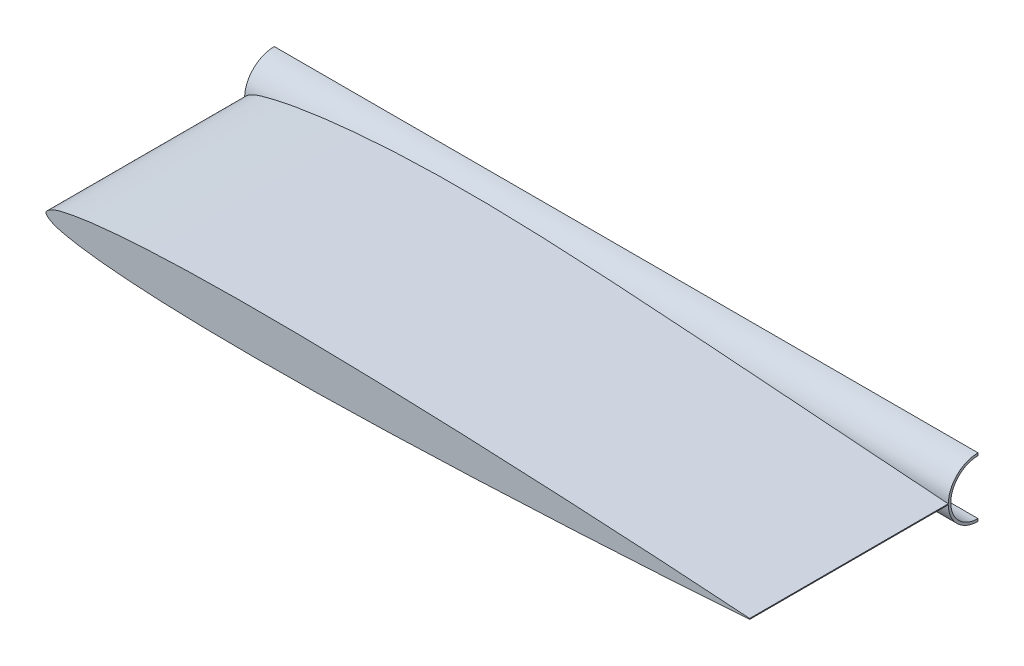
ISO-10303-21;
HEADER;
FILE_DESCRIPTION(('STEP AP214'),'2;1');
FILE_NAME('part.step','',(''),(''),'','','');
FILE_SCHEMA(('AUTOMOTIVE_DESIGN { 1 0 10303 214 1 1 1 1 }'));
ENDSEC;
DATA;
#1=APPLICATION_CONTEXT('core data for automotive mechanical design processes');
#2=APPLICATION_PROTOCOL_DEFINITION('international standard','automotive_design',2000,#1);
#3=PRODUCT_CONTEXT('',#1,'mechanical');
#4=PRODUCT('Part','Part','',(#3));
#5=PRODUCT_RELATED_PRODUCT_CATEGORY('part','',(#4));
#6=PRODUCT_DEFINITION_FORMATION('','',#4);
#7=PRODUCT_DEFINITION_CONTEXT('part definition',#1,'design');
#8=PRODUCT_DEFINITION('design','',#6,#7);
#9=PRODUCT_DEFINITION_SHAPE('','',#8);
#10=(LENGTH_UNIT() NAMED_UNIT(*) SI_UNIT(.MILLI.,.METRE.));
#11=(NAMED_UNIT(*) PLANE_ANGLE_UNIT() SI_UNIT($,.RADIAN.));
#12=(NAMED_UNIT(*) SI_UNIT($,.STERADIAN.) SOLID_ANGLE_UNIT());
#13=UNCERTAINTY_MEASURE_WITH_UNIT(LENGTH_MEASURE(1.E-05),#10,'distance_accuracy_value','');
#14=(GEOMETRIC_REPRESENTATION_CONTEXT(3) GLOBAL_UNCERTAINTY_ASSIGNED_CONTEXT((#13)) GLOBAL_UNIT_ASSIGNED_CONTEXT((#10,
#11,#12)) REPRESENTATION_CONTEXT('',''));
#15=CARTESIAN_POINT('',(0.,0.,0.));
#16=DIRECTION('',(0.,0.,1.));
#17=DIRECTION('',(1.,0.,0.));
#18=AXIS2_PLACEMENT_3D('',#15,#16,#17);
#19=CARTESIAN_POINT('',(0.,2.65648403185944E-13,0.));
#20=DIRECTION('',(0.,0.,-1.));
#21=DIRECTION('',(-1.,0.,0.));
#22=AXIS2_PLACEMENT_3D('',#19,#20,#21);
#23=PLANE('',#22);
#24=DIRECTION('',(-1.,0.,0.));
#25=VECTOR('',#24,1.);
#26=CARTESIAN_POINT('',(571.5,-22.098,0.));
#27=LINE('',#26,#25);
#28=CARTESIAN_POINT('',(571.5,-22.098,0.));
#29=VERTEX_POINT('',#28);
#30=CARTESIAN_POINT('',(0.,-22.098,0.));
#31=VERTEX_POINT('',#30);
#32=EDGE_CURVE('E49',#29,#31,#27,.T.);
#33=ORIENTED_EDGE('',*,*,#32,.F.);
#34=DIRECTION('',(0.,1.,0.));
#35=VECTOR('',#34,1.);
#36=CARTESIAN_POINT('',(571.5,0.360044999919579,0.));
#37=LINE('',#36,#35);
#38=CARTESIAN_POINT('',(571.5,-24.13,0.));
#39=VERTEX_POINT('',#38);
#40=EDGE_CURVE('E103',#39,#29,#37,.T.);
#41=ORIENTED_EDGE('',*,*,#40,.F.);
#42=DIRECTION('',(1.,0.,0.));
#43=VECTOR('',#42,1.);
#44=CARTESIAN_POINT('',(0.,-24.13,0.));
#45=LINE('',#44,#43);
#46=CARTESIAN_POINT('',(0.,-24.13,0.));
#47=VERTEX_POINT('',#46);
#48=EDGE_CURVE('E128',#47,#39,#45,.T.);
#49=ORIENTED_EDGE('',*,*,#48,.F.);
#50=DIRECTION('',(0.,1.,0.));
#51=VECTOR('',#50,1.);
#52=CARTESIAN_POINT('',(0.,-24.13,0.));
#53=LINE('',#52,#51);
#54=EDGE_CURVE('E163',#47,#31,#53,.T.);
#55=ORIENTED_EDGE('',*,*,#54,.T.);
#56=EDGE_LOOP('',(#33,#41,#49,#55));
#57=FACE_BOUND('',#56,.T.);
#58=ADVANCED_FACE('F33',(#57),#23,.T.);
#59=CARTESIAN_POINT('',(571.5,0.360044999919579,185.42));
#60=CARTESIAN_POINT('',(561.975510313426,1.01538717642884,185.42));
#61=CARTESIAN_POINT('',(542.928912588007,2.32590765775948,185.42));
#62=CARTESIAN_POINT('',(504.832156780951,4.7630267065629,185.42));
#63=CARTESIAN_POINT('',(457.210719030397,7.56222081538328,185.42));
#64=CARTESIAN_POINT('',(400.0595640761,10.5331616854128,185.42));
#65=CARTESIAN_POINT('',(342.909932380057,13.1215454403364,185.42));
#66=CARTESIAN_POINT('',(285.75975984895,15.2280111363781,185.42));
#67=CARTESIAN_POINT('',(228.608301613443,16.7302248223311,185.42));
#68=CARTESIAN_POINT('',(180.976079252393,17.2548876797488,185.42));
#69=CARTESIAN_POINT('',(142.872056014563,17.0472813553944,185.42));
#70=CARTESIAN_POINT('',(114.293689391611,16.4832136249963,185.42));
#71=CARTESIAN_POINT('',(85.7003991028661,15.3962416866348,185.42));
#72=CARTESIAN_POINT('',(61.9023768455399,13.8854038275558,185.42));
#73=CARTESIAN_POINT('',(42.8099405535945,12.0568553383374,185.42));
#74=CARTESIAN_POINT('',(28.6197496739266,10.3328197071644,185.42));
#75=CARTESIAN_POINT('',(16.2516084310247,7.95840471478376,185.42));
#76=CARTESIAN_POINT('',(7.18490939323513,5.85814304550578,185.42));
#77=CARTESIAN_POINT('',(-3.92729371811206,8.630435589854E-13,185.42));
#78=CARTESIAN_POINT('',(7.184909393234,-5.858143045507,185.42));
#79=CARTESIAN_POINT('',(16.2516084310231,-7.95840471478734,185.42));
#80=CARTESIAN_POINT('',(28.6197496739236,-10.3328197071719,185.42));
#81=CARTESIAN_POINT('',(42.8099405535911,-12.0568553383483,185.42));
#82=CARTESIAN_POINT('',(61.9023768455363,-13.885403827572,185.42));
#83=CARTESIAN_POINT('',(85.7003991028616,-15.396241686658,185.42));
#84=CARTESIAN_POINT('',(114.293689391606,-16.4832136250276,185.42));
#85=CARTESIAN_POINT('',(142.872056014559,-17.0472813554337,185.42));
#86=CARTESIAN_POINT('',(180.976079252388,-17.2548876797989,185.42));
#87=CARTESIAN_POINT('',(228.608301613438,-16.730224822395,185.42));
#88=CARTESIAN_POINT('',(285.759759848946,-15.228011136458,185.42));
#89=CARTESIAN_POINT('',(342.909932380053,-13.1215454404324,185.42));
#90=CARTESIAN_POINT('',(400.059564076098,-10.5331616855254,185.42));
#91=CARTESIAN_POINT('',(457.210719030393,-7.56222081551185,185.42));
#92=CARTESIAN_POINT('',(504.832156780949,-4.76302670670527,185.42));
#93=CARTESIAN_POINT('',(542.928912588006,-2.32590765791235,185.42));
#94=CARTESIAN_POINT('',(561.975510313426,-1.01538717658738,185.42));
#95=CARTESIAN_POINT('',(571.5,-0.360045000080395,185.42));
#96=B_SPLINE_CURVE_WITH_KNOTS('',3,(#59,#60,#61,#62,#63,#64,#65,#66,#67,#68,#69,#70,#71,#72,#73,
#74,#75,#76,#77,#78,#79,#80,#81,#82,#83,#84,#85,#86,#87,#88,#89,#90,#91,#92,#93,#94,#95),
.UNSPECIFIED.,.F.,.F.,(4,1,1,1,1,1,1,1,1,1,1,1,1,1,1,1,1,1,1,1,1,1,1,1,1,1,1,1,1,1,1,1,1,1,4),
(0.,0.0249245577594703,0.0498428830048284,0.0996630479535091,0.149464505803989,
0.199249098798805,0.249016479528594,0.298766909273868,0.348503608962617,0.373371187827416,
0.398243492902326,0.423129722742987,0.448051612806012,0.46054281715137,0.473079727808674,
0.485731111482558,0.492200581361296,0.5,0.507799418638703,0.514268888517442,0.526920272191325,
0.53945718284863,0.551948387193988,0.576870277257013,0.601756507097674,0.626628812172583,
0.651496391037383,0.701233090726132,0.750983520471406,0.800750901201195,0.850535494196011,
0.900336952046491,0.950157116995171,0.97507544224053,1.),.UNSPECIFIED.);
#97=DIRECTION('',(0.,0.,-1.));
#98=VECTOR('',#97,1.);
#99=SURFACE_OF_LINEAR_EXTRUSION('',#96,#98);
#100=DIRECTION('',(0.,0.,-1.));
#101=VECTOR('',#100,1.);
#102=CARTESIAN_POINT('',(571.5,0.360044999919579,185.42));
#103=LINE('',#102,#101);
#104=CARTESIAN_POINT('',(571.5,0.360044999919579,185.42));
#105=VERTEX_POINT('',#104);
#106=CARTESIAN_POINT('',(571.5,0.360044999919579,24.1273137252789));
#107=VERTEX_POINT('',#106);
#108=EDGE_CURVE('E117',#105,#107,#103,.T.);
#109=ORIENTED_EDGE('',*,*,#108,.T.);
#110=CARTESIAN_POINT('',(571.5,0.360044999919579,24.127313725279));
#111=CARTESIAN_POINT('',(569.494612814188,0.498027175384149,24.125259596626));
#112=CARTESIAN_POINT('',(567.489226862929,0.636010052244875,24.1220118367728));
#113=CARTESIAN_POINT('',(563.478430342691,0.911547541982615,24.113168949584));
#114=CARTESIAN_POINT('',(561.473019773708,1.04910215477898,24.1075738218065));
#115=CARTESIAN_POINT('',(557.462117903023,1.32335543382156,24.0940759942613));
#116=CARTESIAN_POINT('',(555.456626600565,1.46005408732549,24.0861732602244));
#117=CARTESIAN_POINT('',(551.445567431259,1.73217307716122,24.0681337717568));
#118=CARTESIAN_POINT('',(549.439999564419,1.86759341359446,24.0579970175036));
#119=CARTESIAN_POINT('',(545.427318678274,2.13679442832964,24.0355834067776));
#120=CARTESIAN_POINT('',(543.420205583739,2.27057385917179,24.0233050185052));
#121=CARTESIAN_POINT('',(539.405857530471,2.53608514698229,23.9967286049582));
#122=CARTESIAN_POINT('',(537.398622571738,2.66781700396972,23.9824305797025));
#123=CARTESIAN_POINT('',(531.376817973433,3.06019420514645,23.9366142678411));
#124=CARTESIAN_POINT('',(527.362086450996,3.31802534655848,23.9021733928371));
#125=CARTESIAN_POINT('',(521.338341127273,3.69992074183701,23.8450004869289));
#126=CARTESIAN_POINT('',(519.329456569418,3.82645355803826,23.825016389999));
#127=CARTESIAN_POINT('',(515.311611483961,4.07800766524361,23.7832506732919));
#128=CARTESIAN_POINT('',(513.302650956361,4.20302895628632,23.7614690535605));
#129=CARTESIAN_POINT('',(507.275662823469,4.57591051680113,23.6934967636217));
#130=CARTESIAN_POINT('',(503.257529414434,4.82158842639988,23.6446786697861));
#131=CARTESIAN_POINT('',(495.221001589961,5.30711378324128,23.5404566118722));
#132=CARTESIAN_POINT('',(491.202607174877,5.54696123824382,23.4850526565598));
#133=CARTESIAN_POINT('',(483.165567564045,6.02085496082444,23.368049998276));
#134=CARTESIAN_POINT('',(479.146922368327,6.25490122908315,23.3064512960314));
#135=CARTESIAN_POINT('',(467.090203884296,6.94839221046349,23.1129230412606));
#136=CARTESIAN_POINT('',(459.051769248333,7.39916363711595,22.9722668874875));
#137=CARTESIAN_POINT('',(442.973199069874,8.27778457864564,22.6704860382135));
#138=CARTESIAN_POINT('',(434.933063437439,8.70563171322267,22.5093592230134));
#139=CARTESIAN_POINT('',(422.879454013894,9.32990586101305,22.2544408129499));
#140=CARTESIAN_POINT('',(418.866279505055,9.53490511430028,22.1673473327695));
#141=CARTESIAN_POINT('',(410.839735797848,9.93922617734062,21.9890317130256));
#142=CARTESIAN_POINT('',(406.826366599476,10.1385479869726,21.897809573374));
#143=CARTESIAN_POINT('',(398.799550313024,10.5315564602255,21.711528671359));
#144=CARTESIAN_POINT('',(394.786103229992,10.7252432762173,21.6164700129016));
#145=CARTESIAN_POINT('',(386.759012355953,11.1067403590714,21.4229548269877));
#146=CARTESIAN_POINT('',(382.74536856495,11.2945506260416,21.3244982995935));
#147=CARTESIAN_POINT('',(370.705719985637,11.8486049728162,21.0248323268245));
#148=CARTESIAN_POINT('',(362.679391524291,12.2055514990304,20.8192888158671));
#149=CARTESIAN_POINT('',(350.64065887397,12.7204579314204,20.505786993676));
#150=CARTESIAN_POINT('',(346.628621009048,12.8886451326178,20.4004420412207));
#151=CARTESIAN_POINT('',(338.604281640505,13.2178956259174,20.1886713960415));
#152=CARTESIAN_POINT('',(334.591980136882,13.3789589179726,20.0822457033106));
#153=CARTESIAN_POINT('',(322.559036236083,13.850719909916,19.7625529128961));
#154=CARTESIAN_POINT('',(314.537961907818,14.1501773918521,19.5487541616788));
#155=CARTESIAN_POINT('',(302.506024746112,14.5745441726265,19.2320260334751));
#156=CARTESIAN_POINT('',(298.495648555551,14.7118531079274,19.1271199670072));
#157=CARTESIAN_POINT('',(290.474553177516,14.9778545903919,18.9195468618802));
#158=CARTESIAN_POINT('',(286.463833990006,15.1065471366607,18.8168798234535));
#159=CARTESIAN_POINT('',(274.429491880497,15.4789920422542,18.5137723368665));
#160=CARTESIAN_POINT('',(266.405307058189,15.7090540576267,18.3182690569277));
#161=CARTESIAN_POINT('',(254.365427372041,16.0217052728962,18.0438718543567));
#162=CARTESIAN_POINT('',(250.350366496448,16.120539377309,17.9555261442389));
#163=CARTESIAN_POINT('',(242.319803333118,16.3065222035136,17.786791593053));
#164=CARTESIAN_POINT('',(238.304301045302,16.3936709231806,17.7064027534319));
#165=CARTESIAN_POINT('',(230.268903256341,16.5555546787813,17.5551362412387));
#166=CARTESIAN_POINT('',(226.249007326981,16.6302773913937,17.4842680238351));
#167=CARTESIAN_POINT('',(218.208798002674,16.7661720094394,17.3539978259112));
#168=CARTESIAN_POINT('',(214.188484607807,16.8273439174757,17.2945958431884));
#169=CARTESIAN_POINT('',(206.141704769667,16.9349787817641,17.1892143582592));
#170=CARTESIAN_POINT('',(202.1152377834,16.9814204828883,17.1432542595567));
#171=CARTESIAN_POINT('',(194.061997565483,17.0582804440231,17.0667787834912));
#172=CARTESIAN_POINT('',(190.035224333785,17.088698701515,17.036263408556));
#173=CARTESIAN_POINT('',(183.291659925335,17.1252030604681,16.9995508527358));
#174=CARTESIAN_POINT('',(180.574918641098,17.1359858044427,16.9886718524777));
#175=CARTESIAN_POINT('',(175.14139314999,17.1493504901306,16.975181214688));
#176=CARTESIAN_POINT('',(172.424608943106,17.1519324294573,16.9725695795622));
#177=CARTESIAN_POINT('',(166.99104897754,17.1484610984726,16.9760769888822));
#178=CARTESIAN_POINT('',(164.274273218863,17.1424078231369,16.9821960384076));
#179=CARTESIAN_POINT('',(158.839834737006,17.1208998590137,17.0038797380296));
#180=CARTESIAN_POINT('',(156.122172039667,17.1054418485908,17.0194477253686));
#181=CARTESIAN_POINT('',(150.686998623769,17.0643949733378,17.0606029137189));
#182=CARTESIAN_POINT('',(147.969487905153,17.0388061124063,17.0861901108744));
#183=CARTESIAN_POINT('',(142.534708266083,16.976778819242,17.1478219496162));
#184=CARTESIAN_POINT('',(139.817439345546,16.9403403908163,17.183866587533));
#185=CARTESIAN_POINT('',(134.385507447698,16.855813874669,17.2667873519538));
#186=CARTESIAN_POINT('',(131.670844182772,16.8077355020643,17.3136544441481));
#187=CARTESIAN_POINT('',(126.24197994774,16.6990251475909,17.4185293450513));
#188=CARTESIAN_POINT('',(123.527778978107,16.6383931529663,17.4765371650803));
#189=CARTESIAN_POINT('',(118.099964468624,16.5037384765016,17.6037523299485));
#190=CARTESIAN_POINT('',(115.386350930033,16.4297157662772,17.6729596985273));
#191=CARTESIAN_POINT('',(109.964927891871,16.2674549113691,17.8224291516329));
#192=CARTESIAN_POINT('',(107.257117017368,16.1792435729358,17.9026703495135));
#193=CARTESIAN_POINT('',(101.842422495067,15.986907839188,18.0746322638326));
#194=CARTESIAN_POINT('',(99.1355388458325,15.8827834686446,18.1663529624015));
#195=CARTESIAN_POINT('',(95.0760734848016,15.713520118641,18.3125014667624));
#196=CARTESIAN_POINT('',(93.7230614025541,15.6549195211512,18.3626455569375));
#197=CARTESIAN_POINT('',(91.0173489750398,15.5331589423579,18.465758722287));
#198=CARTESIAN_POINT('',(89.6646486298327,15.4699989601824,18.5187277980017));
#199=CARTESIAN_POINT('',(86.9632206476611,15.339123718419,18.6272754840022));
#200=CARTESIAN_POINT('',(85.6144920989976,15.2714211496957,18.6828467030957));
#201=CARTESIAN_POINT('',(82.917410425172,15.1310235113904,18.7967338525828));
#202=CARTESIAN_POINT('',(81.5690572999852,15.0583284421354,18.8550497827965));
#203=CARTESIAN_POINT('',(78.872779922257,14.9074461633021,18.9745676127859));
#204=CARTESIAN_POINT('',(77.5248556712992,14.8292589336762,19.0357695230958));
#205=CARTESIAN_POINT('',(74.8295045925849,14.6669347642415,19.161117226153));
#206=CARTESIAN_POINT('',(73.4820777647104,14.5827978258443,19.225263018202));
#207=CARTESIAN_POINT('',(69.4405594511022,14.3207574251521,19.4221721561944));
#208=CARTESIAN_POINT('',(66.7472941931586,14.1332279175164,19.559404428625));
#209=CARTESIAN_POINT('',(62.7133700254269,13.8302382513466,19.7736325095592));
#210=CARTESIAN_POINT('',(61.3716459979142,13.7257912085777,19.8463281493906));
#211=CARTESIAN_POINT('',(58.6889711095807,13.509161048891,19.9944170185063));
#212=CARTESIAN_POINT('',(57.3480202474593,13.3969779450253,20.0698102432393));
#213=CARTESIAN_POINT('',(54.6669896774844,13.1644591635801,20.2230881226757));
#214=CARTESIAN_POINT('',(53.3269099561783,13.0441236150649,20.3009727379268));
#215=CARTESIAN_POINT('',(50.6476654850381,12.7949240436153,20.4589489510625));
#216=CARTESIAN_POINT('',(49.3085007394561,12.6660599813148,20.5390405591332));
#217=CARTESIAN_POINT('',(47.3005527834371,12.4660507700136,20.6606039936148));
#218=CARTESIAN_POINT('',(46.6313902390493,12.3982643338253,20.7013615532925));
#219=CARTESIAN_POINT('',(45.2933269391648,12.2603955297628,20.7833114445876));
#220=CARTESIAN_POINT('',(44.6244261840186,12.1903131588247,20.824503776785));
#221=CARTESIAN_POINT('',(43.6212848691747,12.0834210765782,20.886587377707));
#222=CARTESIAN_POINT('',(43.2869407081742,12.0474957721984,20.9073310133866));
#223=CARTESIAN_POINT('',(42.6183224493576,11.975050875091,20.9489092929345));
#224=CARTESIAN_POINT('',(42.2840483515509,11.9385312822844,20.969743936815));
#225=CARTESIAN_POINT('',(41.281349463954,11.8279709061403,21.0324319392949));
#226=CARTESIAN_POINT('',(40.6130458507015,11.752928288295,21.0744695064017));
#227=CARTESIAN_POINT('',(39.6919774694922,11.6472034902939,21.1329280570582));
#228=CARTESIAN_POINT('',(39.4390307804495,11.6179297712962,21.1490363914483));
#229=CARTESIAN_POINT('',(38.9332037423362,11.5588784195628,21.1813683087685));
#230=CARTESIAN_POINT('',(38.680323393224,11.529100787144,21.1975918916262));
#231=CARTESIAN_POINT('',(37.9217920374367,11.4389634941452,21.2464511913556));
#232=CARTESIAN_POINT('',(37.4162484838272,11.3777991814642,21.2792756012634));
#233=CARTESIAN_POINT('',(36.405244982453,11.2530402402847,21.3455142172156));
#234=CARTESIAN_POINT('',(35.8997851991166,11.1894444271282,21.3789287063756));
#235=CARTESIAN_POINT('',(34.8892469475304,11.0596079243544,21.4463823778531));
#236=CARTESIAN_POINT('',(34.3841684800257,10.9933672295836,21.4804215613878));
#237=CARTESIAN_POINT('',(32.8682328192484,10.7901374292805,21.5836281313882));
#238=CARTESIAN_POINT('',(31.8580181024714,10.6488049819081,21.6537968113347));
#239=CARTESIAN_POINT('',(30.3431742394655,10.4266926062339,21.7611519836912));
#240=CARTESIAN_POINT('',(29.8377411975389,10.3508790943105,21.7973290250235));
#241=CARTESIAN_POINT('',(28.8274689616563,10.1956918081548,21.8703480845957));
#242=CARTESIAN_POINT('',(28.3226297675778,10.1163180346581,21.9071901026982));
#243=CARTESIAN_POINT('',(27.3119562221961,9.95376833178107,21.9815240876133));
#244=CARTESIAN_POINT('',(26.8061238138175,9.87058111065058,22.0190177491496));
#245=CARTESIAN_POINT('',(25.7950426390187,9.70086682294544,22.0943138614026));
#246=CARTESIAN_POINT('',(25.2897938730566,9.61433975375101,22.1321163123614));
#247=CARTESIAN_POINT('',(24.2778026232203,9.43772551225243,22.2080055779193));
#248=CARTESIAN_POINT('',(23.77106246581,9.34762524396369,22.2460929233527));
#249=CARTESIAN_POINT('',(22.7581405838983,9.16432303417074,22.3222295820734));
#250=CARTESIAN_POINT('',(22.2519588596202,9.07112109142595,22.3602788953455));
#251=CARTESIAN_POINT('',(21.2500419544565,8.88356055550116,22.435446469351));
#252=CARTESIAN_POINT('',(20.7542961299645,8.7892602597023,22.4725683823267));
#253=CARTESIAN_POINT('',(19.7633281334266,8.59783016849089,22.5465018706431));
#254=CARTESIAN_POINT('',(19.268105961105,8.50070037456827,22.5833134461473));
#255=CARTESIAN_POINT('',(18.277639994742,8.30353847782299,22.6565490270252));
#256=CARTESIAN_POINT('',(17.7823967805176,8.20350328897694,22.6929725596099));
#257=CARTESIAN_POINT('',(16.7924434598551,8.00065334451399,22.7652820020963));
#258=CARTESIAN_POINT('',(16.2977333489529,7.89783861236379,22.801167916533));
#259=CARTESIAN_POINT('',(15.3098193281881,7.68958836686872,22.8722348529092));
#260=CARTESIAN_POINT('',(14.8166143521236,7.58415827970912,22.9074170988225));
#261=CARTESIAN_POINT('',(13.8306900169926,7.37052753271516,22.9770570978251));
#262=CARTESIAN_POINT('',(13.337970701885,7.26232664241344,23.0115147902112));
#263=CARTESIAN_POINT('',(12.6020980308332,7.09243709078364,23.0642067366271));
#264=CARTESIAN_POINT('',(12.3580000477238,7.03470948485238,23.0818889216308));
#265=CARTESIAN_POINT('',(11.8706872432773,6.91579001707586,23.1177989955674));
#266=CARTESIAN_POINT('',(11.627472418384,6.85459816919675,23.1360268823));
#267=CARTESIAN_POINT('',(11.1422265936999,6.72806711792622,23.1731385571863));
#268=CARTESIAN_POINT('',(10.9001953495139,6.6627288133595,23.1920222027923));
#269=CARTESIAN_POINT('',(10.4174924845036,6.52738828771356,23.2304767697962));
#270=CARTESIAN_POINT('',(10.1768208627964,6.4573860696637,23.2500476907475));
#271=CARTESIAN_POINT('',(9.69826582700028,6.31278686781427,23.289723294121));
#272=CARTESIAN_POINT('',(9.46037443623893,6.23821541430176,23.309824707134));
#273=CARTESIAN_POINT('',(8.98627383402238,6.08403587108533,23.3505409500717));
#274=CARTESIAN_POINT('',(8.75006461874624,6.00442779282575,23.3711557788297));
#275=CARTESIAN_POINT('',(8.27934610792604,5.84017673204443,23.41274042114));
#276=CARTESIAN_POINT('',(8.04483740633197,5.75553207721134,23.4337103509256));
#277=CARTESIAN_POINT('',(7.57764931817624,5.58137257146053,23.4758003370669));
#278=CARTESIAN_POINT('',(7.34496994104682,5.49185769545009,23.4969203941956));
#279=CARTESIAN_POINT('',(6.88171300746138,5.30828326347574,23.5390717315741));
#280=CARTESIAN_POINT('',(6.65113335237297,5.21422901973892,23.5601030857095));
#281=CARTESIAN_POINT('',(6.19197288147391,5.02130057648938,23.6019741998046));
#282=CARTESIAN_POINT('',(5.96339210738784,4.92242627664488,23.6228139557653));
#283=CARTESIAN_POINT('',(5.50858883811098,4.71954033996288,23.6641829859274));
#284=CARTESIAN_POINT('',(5.28236553386649,4.61553054093332,23.6847123678139));
#285=CARTESIAN_POINT('',(4.83259736453702,4.40181643870498,23.7253609652572));
#286=CARTESIAN_POINT('',(4.60905228020916,4.29211260560279,23.745480214484));
#287=CARTESIAN_POINT('',(4.29343202059809,4.13150270056285,23.773723379622));
#288=CARTESIAN_POINT('',(4.20002289399743,4.08324725441024,23.7820614902435));
#289=CARTESIAN_POINT('',(4.0138402026654,3.98551083924533,23.7986356760032));
#290=CARTESIAN_POINT('',(3.9210666313082,3.93602988303418,23.8068717522058));
#291=CARTESIAN_POINT('',(3.64361043594071,3.78553259516665,23.8314287634577));
#292=CARTESIAN_POINT('',(3.45997079295462,3.68255224225761,23.8475824963004));
#293=CARTESIAN_POINT('',(3.09594959437441,3.47044399005547,23.8793726226509));
#294=CARTESIAN_POINT('',(2.91557176719675,3.36130957884926,23.8950084392728));
#295=CARTESIAN_POINT('',(2.5600493789457,3.13641142314574,23.9255647692203));
#296=CARTESIAN_POINT('',(2.38488503737741,3.0206794753751,23.9404881662476));
#297=CARTESIAN_POINT('',(2.04050032381067,2.78077944686619,23.9695387000511));
#298=CARTESIAN_POINT('',(1.87127519090307,2.65661836864271,23.9836664803587));
#299=CARTESIAN_POINT('',(1.62366475645012,2.46256874915916,24.0041008293722));
#300=CARTESIAN_POINT('',(1.54221312041559,2.39662637025988,24.0107822532103));
#301=CARTESIAN_POINT('',(1.38177873297129,2.26178447574357,24.0238595003009));
#302=CARTESIAN_POINT('',(1.30279565212165,2.1928853576543,24.0302553617122));
#303=CARTESIAN_POINT('',(1.14647187920411,2.05050059622146,24.0428273063287));
#304=CARTESIAN_POINT('',(1.06918453412095,1.97695558437496,24.0489975427559));
#305=CARTESIAN_POINT('',(0.918481665492981,1.82590484653268,24.0609375283347));
#306=CARTESIAN_POINT('',(0.845067227923733,1.74839802150157,24.0667071652987));
#307=CARTESIAN_POINT('',(0.703331022064382,1.58903799237772,24.0777537919977));
#308=CARTESIAN_POINT('',(0.635000371972552,1.50719281774495,24.0830316451971));
#309=CARTESIAN_POINT('',(0.504823306882013,1.33850595503505,24.0929955726817));
#310=CARTESIAN_POINT('',(0.442972605999538,1.25166762909542,24.0976820385395));
#311=CARTESIAN_POINT('',(0.320718083514809,1.06143395909311,24.1068538675474));
#312=CARTESIAN_POINT('',(0.261414364112847,0.957312002068602,24.1112446991522));
#313=CARTESIAN_POINT('',(0.157661841123485,0.741815303061232,24.1188347792517));
#314=CARTESIAN_POINT('',(0.113193882276302,0.630450137054671,24.1220355648957));
#315=CARTESIAN_POINT('',(0.0503357395095094,0.421327727214955,24.1265061366657));
#316=CARTESIAN_POINT('',(0.0287562432203592,0.324569877170833,24.1280148626448));
#317=CARTESIAN_POINT('',(0.00884489231593004,0.177842317380321,24.1293944319177));
#318=CARTESIAN_POINT('',(0.00428339744100345,0.128688903654821,24.1297070887817));
#319=CARTESIAN_POINT('',(-0.000449023330365366,0.0301717032563756,24.1300314445687));
#320=CARTESIAN_POINT('',(-0.000620279212654756,-0.0191920673264529,24.1300431661109));
#321=CARTESIAN_POINT('',(0.00551570170625618,-0.166987472515772,24.129622346605));
#322=CARTESIAN_POINT('',(0.0184626801205455,-0.265195951664034,24.1287345075856));
#323=CARTESIAN_POINT('',(0.0597119442308195,-0.458347396781908,24.1258412887696));
#324=CARTESIAN_POINT('',(0.0880472555298011,-0.553282870683401,24.1238335051566));
#325=CARTESIAN_POINT('',(0.149290317615117,-0.717792148090826,24.1194291289234));
#326=CARTESIAN_POINT('',(0.179771891779413,-0.788303086172681,24.1172188944386));
#327=CARTESIAN_POINT('',(0.246825875574952,-0.92637753980592,24.1123101344979));
#328=CARTESIAN_POINT('',(0.28340197521158,-0.993939238238387,24.1096113131351));
#329=CARTESIAN_POINT('',(0.361570178250588,-1.12623700827276,24.1037940085351));
#330=CARTESIAN_POINT('',(0.403172608544024,-1.19096687714597,24.1006746597237));
#331=CARTESIAN_POINT('',(0.490400942395612,-1.31759986979217,24.0940832800822));
#332=CARTESIAN_POINT('',(0.536026169968919,-1.37950346584435,24.0906113084914));
#333=CARTESIAN_POINT('',(0.642490709930981,-1.51598110760428,24.0824517513156));
#334=CARTESIAN_POINT('',(0.704266606252319,-1.58981702593247,24.0776783137827));
#335=CARTESIAN_POINT('',(0.831912015664952,-1.73385521926975,24.0677347886702));
#336=CARTESIAN_POINT('',(0.897783203625949,-1.8040559857943,24.062564538599));
#337=CARTESIAN_POINT('',(1.03288631018629,-1.94129458989901,24.0518818270754));
#338=CARTESIAN_POINT('',(1.10212272926807,-2.00832794149002,24.046368904443));
#339=CARTESIAN_POINT('',(1.24327692979918,-2.13949293430815,24.0350535160742));
#340=CARTESIAN_POINT('',(1.315195180578,-2.20362406324843,24.0292509995971));
#341=CARTESIAN_POINT('',(1.53496231142377,-2.39275210476871,24.011409183266));
#342=CARTESIAN_POINT('',(1.68616101608962,-2.51382676436461,23.9989880051525));
#343=CARTESIAN_POINT('',(1.99467826120484,-2.74741706176597,23.9733677163172));
#344=CARTESIAN_POINT('',(2.15199162465143,-2.85993971146366,23.9601692590066));
#345=CARTESIAN_POINT('',(2.49360203678217,-3.09325299553203,23.9312426433819));
#346=CARTESIAN_POINT('',(2.67859899649785,-3.21300325508332,23.9154186386444));
#347=CARTESIAN_POINT('',(3.05316826873306,-3.44505828549408,23.8830940632667));
#348=CARTESIAN_POINT('',(3.24274156302351,-3.55736143899532,23.8665933469096));
#349=CARTESIAN_POINT('',(3.62577375177264,-3.77583500176149,23.833006546388));
#350=CARTESIAN_POINT('',(3.81923894512966,-3.88199417314083,23.815919475309));
#351=CARTESIAN_POINT('',(4.20905070280257,-4.0888259144109,23.7812824081109));
#352=CARTESIAN_POINT('',(4.40539751452015,-4.18949800966886,23.7637323721395));
#353=CARTESIAN_POINT('',(4.80062564288295,-4.38606415386455,23.728238881752));
#354=CARTESIAN_POINT('',(4.99950887151258,-4.48195429358496,23.7102951221806));
#355=CARTESIAN_POINT('',(5.39930358385222,-4.66935093669365,23.6741032868466));
#356=CARTESIAN_POINT('',(5.60021511029761,-4.76085734748429,23.6558552046669));
#357=CARTESIAN_POINT('',(6.00421124291469,-4.94001779595407,23.619091875952));
#358=CARTESIAN_POINT('',(6.20729942076664,-5.02766367269139,23.6005761639404));
#359=CARTESIAN_POINT('',(6.61506171709901,-5.19914548347198,23.5633928641579));
#360=CARTESIAN_POINT('',(6.81973583137415,-5.28298142761365,23.5447252767899));
#361=CARTESIAN_POINT('',(7.23025320382326,-5.44687934780819,23.5073489364855));
#362=CARTESIAN_POINT('',(7.43609443949123,-5.52694641165921,23.4886402769412));
#363=CARTESIAN_POINT('',(7.84921351802451,-5.68330195631427,23.451299343049));
#364=CARTESIAN_POINT('',(8.0564913521431,-5.75959046010102,23.4326670682373));
#365=CARTESIAN_POINT('',(8.47233393457042,-5.90821934349366,23.3956343571641));
#366=CARTESIAN_POINT('',(8.68089781255333,-5.98056212353133,23.3772337853047));
#367=CARTESIAN_POINT('',(9.09938575753549,-6.12129732893319,23.3407777069753));
#368=CARTESIAN_POINT('',(9.30930983370706,-6.1896897276276,23.3227222028354));
#369=CARTESIAN_POINT('',(9.72770214123609,-6.32168736683858,23.2872879234159));
#370=CARTESIAN_POINT('',(9.93615393583466,-6.38534319588075,23.2699034079915));
#371=CARTESIAN_POINT('',(10.3541958313622,-6.50895256570034,23.2356310670891));
#372=CARTESIAN_POINT('',(10.5637859523385,-6.56890604104297,23.2187432503923));
#373=CARTESIAN_POINT('',(10.9839824391927,-6.68534270842156,23.1854859759127));
#374=CARTESIAN_POINT('',(11.1945888729868,-6.74182566497335,23.1691165533407));
#375=CARTESIAN_POINT('',(11.6166546508075,-6.85166173355239,23.1368733437383));
#376=CARTESIAN_POINT('',(11.8281140053158,-6.90501480699007,23.12099956282));
#377=CARTESIAN_POINT('',(12.2519669935998,-7.00910557446917,23.0896578012086));
#378=CARTESIAN_POINT('',(12.4643614314907,-7.05984013251734,23.0741903175105));
#379=CARTESIAN_POINT('',(12.8896694154073,-7.15917661286371,23.0435629104447));
#380=CARTESIAN_POINT('',(13.1025829638319,-7.20777852528732,23.0284029885011));
#381=CARTESIAN_POINT('',(13.5287588105478,-7.30346634862157,22.9982346489523));
#382=CARTESIAN_POINT('',(13.7420211076878,-7.35055226452721,22.9832262308479));
#383=CARTESIAN_POINT('',(14.0620544837929,-7.42052915121467,22.9606891314672));
#384=CARTESIAN_POINT('',(14.1687555353487,-7.44374610224423,22.9531726906896));
#385=CARTESIAN_POINT('',(14.3821845230493,-7.49004526692085,22.9381061686339));
#386=CARTESIAN_POINT('',(14.4889124591954,-7.51312748056094,22.9305560873541));
#387=CARTESIAN_POINT('',(14.8095822393031,-7.5822720142622,22.9078241847658));
#388=CARTESIAN_POINT('',(15.023563579379,-7.62813480001637,22.8925920911432));
#389=CARTESIAN_POINT('',(15.4516295455178,-7.71933158747927,22.8620019457914));
#390=CARTESIAN_POINT('',(15.6657141714468,-7.76466558987101,22.846643894225));
#391=CARTESIAN_POINT('',(16.3081118225026,-7.89987778188944,22.8003927042217));
#392=CARTESIAN_POINT('',(16.7365781418117,-7.98896820898853,22.7693218548872));
#393=CARTESIAN_POINT('',(17.5944814800295,-8.16517625639423,22.7067291676605));
#394=CARTESIAN_POINT('',(18.02391903155,-8.25229108872971,22.675206783824));
#395=CARTESIAN_POINT('',(18.8831927945605,-8.42441931099137,22.6118214940818));
#396=CARTESIAN_POINT('',(19.3130290088331,-8.50943268613321,22.5799585857827));
#397=CARTESIAN_POINT('',(20.6035555682916,-8.7613769286716,22.483938476274));
#398=CARTESIAN_POINT('',(21.4648397703498,-8.92512478488325,22.4193809735341));
#399=CARTESIAN_POINT('',(23.1887386221999,-9.24376212983332,22.2898926538774));
#400=CARTESIAN_POINT('',(24.0513527705791,-9.39865437802413,22.224961960266));
#401=CARTESIAN_POINT('',(25.3478865296373,-9.62419834654926,22.127775356542));
#402=CARTESIAN_POINT('',(25.7811859965772,-9.69835894869398,22.0953637262648));
#403=CARTESIAN_POINT('',(26.6482147438972,-9.84422512108709,22.030762410929));
#404=CARTESIAN_POINT('',(27.0819440239259,-9.91593069334142,21.998572725689));
#405=CARTESIAN_POINT('',(27.9492714012754,-10.0566708565614,21.934590002935));
#406=CARTESIAN_POINT('',(28.3828689090366,-10.1257088653414,21.9027964957922));
#407=CARTESIAN_POINT('',(29.2505150844071,-10.2611171069311,21.8396877360879));
#408=CARTESIAN_POINT('',(29.6845637520799,-10.3274873393663,21.8083724835936));
#409=CARTESIAN_POINT('',(30.5526623146383,-10.4576379291969,21.7462617999892));
#410=CARTESIAN_POINT('',(30.9867118164854,-10.5214206875033,21.7154659032307));
#411=CARTESIAN_POINT('',(31.8551915477939,-10.6465860857602,21.6543748763603));
#412=CARTESIAN_POINT('',(32.2896217773825,-10.7079687249083,21.6240797464158));
#413=CARTESIAN_POINT('',(33.5929289948509,-10.8886501108367,21.5339809665124));
#414=CARTESIAN_POINT('',(34.4623294122189,-11.0045580008602,21.4749276573108));
#415=CARTESIAN_POINT('',(36.2020461388819,-11.2284643857782,21.3587076723742));
#416=CARTESIAN_POINT('',(37.0723621638954,-11.3364648564194,21.3015405273371));
#417=CARTESIAN_POINT('',(38.3785210273302,-11.4935107912195,21.2169656877554));
#418=CARTESIAN_POINT('',(38.814029953496,-11.5450345975408,21.1889695196636));
#419=CARTESIAN_POINT('',(39.6852434399838,-11.646593640649,21.1333175128397));
#420=CARTESIAN_POINT('',(40.1209480004419,-11.6966288763988,21.1056616743446));
#421=CARTESIAN_POINT('',(41.4152783117317,-11.8432885481841,21.0239350631566));
#422=CARTESIAN_POINT('',(42.2741436322183,-11.9380216264616,20.9702657342452));
#423=CARTESIAN_POINT('',(43.9923311616695,-12.123604488723,20.8635214322643));
#424=CARTESIAN_POINT('',(44.851653371831,-12.2144542624823,20.8104464607601));
#425=CARTESIAN_POINT('',(46.5712697790445,-12.3923935205316,20.7049800961983));
#426=CARTESIAN_POINT('',(47.4315642484046,-12.4794806385141,20.6525891473623));
#427=CARTESIAN_POINT('',(49.1525644177745,-12.6499725457757,20.548602372527));
#428=CARTESIAN_POINT('',(50.0132701171806,-12.7333773404432,20.4970065453642));
#429=CARTESIAN_POINT('',(51.7354332787598,-12.8966479397221,20.3946723654113));
#430=CARTESIAN_POINT('',(52.5968909048158,-12.9765122467899,20.3439343809773));
#431=CARTESIAN_POINT('',(54.3201760311865,-13.1327741812222,20.2434129358901));
#432=CARTESIAN_POINT('',(55.1820035316974,-13.2091718067463,20.1936294757437));
#433=CARTESIAN_POINT('',(57.768363773329,-13.4333366864784,20.0458087953333));
#434=CARTESIAN_POINT('',(59.4934263815443,-13.5760430440659,19.9493220082953));
#435=CARTESIAN_POINT('',(62.9447559642893,-13.8488702053509,19.7609000165475));
#436=CARTESIAN_POINT('',(64.6710229142193,-13.978991258948,19.6689647214789));
#437=CARTESIAN_POINT('',(68.1204396571829,-14.227307624631,19.4900994070952));
#438=CARTESIAN_POINT('',(69.8435868175585,-14.3455311776964,19.4031577558088));
#439=CARTESIAN_POINT('',(73.2904302430647,-14.5713460117434,19.2341534033928));
#440=CARTESIAN_POINT('',(75.0141263018466,-14.6789396434278,19.1520896251759));
#441=CARTESIAN_POINT('',(78.4620752862974,-14.8844710870483,18.9927966111379));
#442=CARTESIAN_POINT('',(80.186328101804,-14.9824102339903,18.9155667074376));
#443=CARTESIAN_POINT('',(83.6353888039236,-15.1696542097456,18.7657364783748));
#444=CARTESIAN_POINT('',(85.3601966470142,-15.2589596011222,18.6931358514803));
#445=CARTESIAN_POINT('',(88.8103770220929,-15.429793914246,18.5523740480093));
#446=CARTESIAN_POINT('',(90.5357495540407,-15.5113228365493,18.4842128711152));
#447=CARTESIAN_POINT('',(94.5748379258162,-15.6934584781287,18.3300567838011));
#448=CARTESIAN_POINT('',(96.888757965568,-15.7911033260017,18.2458963289953));
#449=CARTESIAN_POINT('',(101.517536879899,-15.9740395962089,18.0859532678709));
#450=CARTESIAN_POINT('',(103.832395809261,-16.0593301451878,18.0101712539341));
#451=CARTESIAN_POINT('',(108.462860296419,-16.2185023080383,17.8669681543585));
#452=CARTESIAN_POINT('',(110.778465881483,-16.292383442708,17.7995474199217));
#453=CARTESIAN_POINT('',(115.410223045718,-16.4297306749168,17.672848152874));
#454=CARTESIAN_POINT('',(117.726374628524,-16.4931967010489,17.6135696760878));
#455=CARTESIAN_POINT('',(122.360944044827,-16.6103548017908,17.5031283165387));
#456=CARTESIAN_POINT('',(124.679362226592,-16.6640391398543,17.4519718617348));
#457=CARTESIAN_POINT('',(129.316503215363,-16.7620972648422,17.3578113184966));
#458=CARTESIAN_POINT('',(131.6352260135,-16.8064712801637,17.314807030079));
#459=CARTESIAN_POINT('',(136.272915560877,-16.8864535645082,17.2368125471747));
#460=CARTESIAN_POINT('',(138.591882305055,-16.92206198916,17.2018222104048));
#461=CARTESIAN_POINT('',(143.2299967517,-16.9850659390365,17.139614504753));
#462=CARTESIAN_POINT('',(145.549144451074,-17.0124615827767,17.1123970237042));
#463=CARTESIAN_POINT('',(150.961181477484,-17.067364541918,17.057665738927));
#464=CARTESIAN_POINT('',(154.054131369471,-17.0918611212492,17.0330812582326));
#465=CARTESIAN_POINT('',(160.240187404747,-17.1281665701494,16.9965720576601));
#466=CARTESIAN_POINT('',(163.333293548488,-17.1399754007353,16.9846473766793));
#467=CARTESIAN_POINT('',(167.973041367112,-17.1489820572542,16.975550577206));
#468=CARTESIAN_POINT('',(169.519668855599,-17.1505331232986,16.9739834027837));
#469=CARTESIAN_POINT('',(172.612924505994,-17.150870292233,16.9736427841083));
#470=CARTESIAN_POINT('',(174.159552667903,-17.1496563950834,16.9748693398951));
#471=CARTESIAN_POINT('',(178.799419753109,-17.1419751843857,16.9826281562313));
#472=CARTESIAN_POINT('',(181.892646651779,-17.13146836141,16.9932395558414));
#473=CARTESIAN_POINT('',(188.079228795151,-17.1002245539592,17.0246792539079));
#474=CARTESIAN_POINT('',(191.172584031826,-17.0794867946152,17.0455083262281));
#475=CARTESIAN_POINT('',(197.35913418689,-17.0283289193849,17.0966138576638));
#476=CARTESIAN_POINT('',(200.452329105253,-16.9979088018943,17.1268903183449));
#477=CARTESIAN_POINT('',(209.732065506093,-16.8929358273511,17.2306526829459));
#478=CARTESIAN_POINT('',(215.918314806709,-16.8046727459049,17.3170690805035));
#479=CARTESIAN_POINT('',(225.197048976379,-16.6481609166411,17.4671350308894));
#480=CARTESIAN_POINT('',(228.28992030702,-16.5919693031788,17.520565276876));
#481=CARTESIAN_POINT('',(234.475410148307,-16.4720523526559,17.6333544468545));
#482=CARTESIAN_POINT('',(237.568028658959,-16.4083270157605,17.6927133707163));
#483=CARTESIAN_POINT('',(246.845402384552,-16.2064055532757,17.8785547934523));
#484=CARTESIAN_POINT('',(253.029769509204,-16.0574623706903,18.0128035066951));
#485=CARTESIAN_POINT('',(265.398583423745,-15.7339694568256,18.2960447582973));
#486=CARTESIAN_POINT('',(271.583030033017,-15.5594151861567,18.4450399088346));
#487=CARTESIAN_POINT('',(280.85881348754,-15.280711579206,18.6754206970531));
#488=CARTESIAN_POINT('',(283.950493343237,-15.18500171982,18.75335966507));
#489=CARTESIAN_POINT('',(290.13364267394,-14.9883192245622,18.9109245201804));
#490=CARTESIAN_POINT('',(293.22511214895,-14.8873465887926,18.9905504072412));
#491=CARTESIAN_POINT('',(302.498953951849,-14.5767863560505,19.2312961217307));
#492=CARTESIAN_POINT('',(308.681022557864,-14.3595484982939,19.3942906138101));
#493=CARTESIAN_POINT('',(321.044267657626,-13.9060786786245,19.7219709700234));
#494=CARTESIAN_POINT('',(327.2254441691,-13.6698471688102,19.8866567938179));
#495=CARTESIAN_POINT('',(339.587083796735,-13.179806586779,20.2147608021331));
#496=CARTESIAN_POINT('',(345.767546918199,-12.9259976549468,20.3781789967663));
#497=CARTESIAN_POINT('',(358.12791996092,-12.4020717542752,20.7012136472573));
#498=CARTESIAN_POINT('',(364.30782987843,-12.1319546822926,20.8608300790613));
#499=CARTESIAN_POINT('',(376.075198488607,-11.6031076497736,21.1591097907375));
#500=CARTESIAN_POINT('',(381.662705861421,-11.3457652379152,21.2983156243051));
#501=CARTESIAN_POINT('',(392.837401697155,-10.8195251639533,21.5704084224974));
#502=CARTESIAN_POINT('',(398.424590155107,-10.5506273547212,21.703295306621));
#503=CARTESIAN_POINT('',(409.598653099501,-10.0019351289353,21.9615621345374));
#504=CARTESIAN_POINT('',(415.185527582892,-9.72214062033686,22.0869420148957));
#505=CARTESIAN_POINT('',(426.358918927981,-9.15152611577773,22.3294097480962));
#506=CARTESIAN_POINT('',(431.945435787974,-8.86070607067024,22.4464975639696));
#507=CARTESIAN_POINT('',(443.118074974634,-8.26801689332172,22.6715082610095));
#508=CARTESIAN_POINT('',(448.704197300832,-7.96614774814965,22.7794311314495));
#509=CARTESIAN_POINT('',(459.87600987034,-7.35131005465193,22.9852177414457));
#510=CARTESIAN_POINT('',(465.461700114195,-7.03834152057436,23.083081493914));
#511=CARTESIAN_POINT('',(476.62956622668,-6.40142440781111,23.2677576767356));
#512=CARTESIAN_POINT('',(482.211742343941,-6.07748193948778,23.3545761331598));
#513=CARTESIAN_POINT('',(493.37559365376,-5.41840318419668,23.5162274147095));
#514=CARTESIAN_POINT('',(498.957268847662,-5.08326692823533,23.5910602730314));
#515=CARTESIAN_POINT('',(507.329377058985,-4.57211207522253,23.6935195746498));
#516=CARTESIAN_POINT('',(510.120009361703,-4.40031890222625,23.7260409811331));
#517=CARTESIAN_POINT('',(515.701138349033,-4.05393134533232,23.7876754884471));
#518=CARTESIAN_POINT('',(518.491635033632,-3.87933696117011,23.8167885889559));
#519=CARTESIAN_POINT('',(524.072467508714,-3.52706625959925,23.8714991904494));
#520=CARTESIAN_POINT('',(526.862803299247,-3.34938994316314,23.8970966925434));
#521=CARTESIAN_POINT('',(532.443285684131,-2.9906147196502,23.9446417883636));
#522=CARTESIAN_POINT('',(535.233432278526,-2.80951581339326,23.9665893829641));
#523=CARTESIAN_POINT('',(539.418495679476,-2.53506616459767,23.9966415409131));
#524=CARTESIAN_POINT('',(540.813494221061,-2.44311583322547,24.0061807415129));
#525=CARTESIAN_POINT('',(543.603432164289,-2.25822673343812,24.0242781160795));
#526=CARTESIAN_POINT('',(544.998371565932,-2.16528796502583,24.0328362900492));
#527=CARTESIAN_POINT('',(549.183112221241,-1.88516995071207,24.0569771434508));
#528=CARTESIAN_POINT('',(551.972835371055,-1.6966890321406,24.071026150366));
#529=CARTESIAN_POINT('',(557.552166028889,-1.31742419313351,24.0947575706986));
#530=CARTESIAN_POINT('',(560.341773535784,-1.12664025398662,24.1044399486141));
#531=CARTESIAN_POINT('',(565.920919981311,-0.743919840466838,24.1192949226377));
#532=CARTESIAN_POINT('',(568.71045891998,-0.551983366733353,24.1244675212475));
#533=CARTESIAN_POINT('',(571.5,-0.360045000080395,24.1273137252765));
#534=B_SPLINE_CURVE_WITH_KNOTS('',3,(#110,#111,#112,#113,#114,#115,#116,#117,#118,#119,#120,
#121,#122,#123,#124,#125,#126,#127,#128,#129,#130,#131,#132,#133,#134,#135,#136,#137,#138,#139,
#140,#141,#142,#143,#144,#145,#146,#147,#148,#149,#150,#151,#152,#153,#154,#155,#156,#157,#158,
#159,#160,#161,#162,#163,#164,#165,#166,#167,#168,#169,#170,#171,#172,#173,#174,#175,#176,#177,
#178,#179,#180,#181,#182,#183,#184,#185,#186,#187,#188,#189,#190,#191,#192,#193,#194,#195,#196,
#197,#198,#199,#200,#201,#202,#203,#204,#205,#206,#207,#208,#209,#210,#211,#212,#213,#214,#215,
#216,#217,#218,#219,#220,#221,#222,#223,#224,#225,#226,#227,#228,#229,#230,#231,#232,#233,#234,
#235,#236,#237,#238,#239,#240,#241,#242,#243,#244,#245,#246,#247,#248,#249,#250,#251,#252,#253,
#254,#255,#256,#257,#258,#259,#260,#261,#262,#263,#264,#265,#266,#267,#268,#269,#270,#271,#272,
#273,#274,#275,#276,#277,#278,#279,#280,#281,#282,#283,#284,#285,#286,#287,#288,#289,#290,#291,
#292,#293,#294,#295,#296,#297,#298,#299,#300,#301,#302,#303,#304,#305,#306,#307,#308,#309,#310,
#311,#312,#313,#314,#315,#316,#317,#318,#319,#320,#321,#322,#323,#324,#325,#326,#327,#328,#329,
#330,#331,#332,#333,#334,#335,#336,#337,#338,#339,#340,#341,#342,#343,#344,#345,#346,#347,#348,
#349,#350,#351,#352,#353,#354,#355,#356,#357,#358,#359,#360,#361,#362,#363,#364,#365,#366,#367,
#368,#369,#370,#371,#372,#373,#374,#375,#376,#377,#378,#379,#380,#381,#382,#383,#384,#385,#386,
#387,#388,#389,#390,#391,#392,#393,#394,#395,#396,#397,#398,#399,#400,#401,#402,#403,#404,#405,
#406,#407,#408,#409,#410,#411,#412,#413,#414,#415,#416,#417,#418,#419,#420,#421,#422,#423,#424,
#425,#426,#427,#428,#429,#430,#431,#432,#433,#434,#435,#436,#437,#438,#439,#440,#441,#442,#443,
#444,#445,#446,#447,#448,#449,#450,#451,#452,#453,#454,#455,#456,#457,#458,#459,#460,#461,#462,
#463,#464,#465,#466,#467,#468,#469,#470,#471,#472,#473,#474,#475,#476,#477,#478,#479,#480,#481,
#482,#483,#484,#485,#486,#487,#488,#489,#490,#491,#492,#493,#494,#495,#496,#497,#498,#499,#500,
#501,#502,#503,#504,#505,#506,#507,#508,#509,#510,#511,#512,#513,#514,#515,#516,#517,#518,#519,
#520,#521,#522,#523,#524,#525,#526,#527,#528,#529,#530,#531,#532,#533),.UNSPECIFIED.,.F.,.F.,(4,
2,2,2,2,2,2,2,2,2,2,2,2,2,2,2,2,2,2,2,2,2,2,2,2,2,2,2,2,2,2,2,2,2,2,2,2,2,2,2,2,2,2,2,2,2,2,2,2,
2,2,2,2,2,2,2,2,2,2,2,2,2,2,2,2,2,2,2,2,2,2,2,2,2,2,2,2,2,2,2,2,2,2,2,2,2,2,2,2,2,2,2,2,2,2,2,2,
2,2,2,2,2,2,2,2,2,2,2,2,2,2,2,2,2,2,2,2,2,2,2,2,2,2,2,2,2,2,2,2,2,2,2,2,2,2,2,2,2,2,2,2,2,2,2,2,
2,2,2,2,2,2,2,2,2,2,2,2,2,2,2,2,2,2,2,2,2,2,2,2,2,2,2,2,2,2,2,2,2,2,2,2,2,2,2,2,2,2,2,2,2,2,2,2,
2,2,2,2,2,2,2,2,2,2,2,2,2,2,2,2,2,2,4),(0.,6.03038856093897,12.0607782574224,18.0912575132349,
24.121736290526,30.1565461773784,36.1913560079989,48.2607887660612,54.2996820017675,
60.3385750832668,72.4163634898986,84.4941358210522,96.5719067351767,120.728715615519,
144.888027930577,156.946074726691,169.004121780117,181.061842479184,193.119562956934,
217.230177402988,229.281001492559,241.331825661763,265.420279715948,277.462562328344,
289.504846191015,313.594286635636,325.646012983668,337.69774152315,349.761351825551,
361.824959810689,373.905896754087,385.986835596503,394.137166788537,402.287500352335,
410.437838658091,418.591057234257,426.744272672802,434.897485250328,443.043916181365,
451.190355390132,459.336811867106,467.46805440485,475.599284285221,479.664901113305,
483.730518719046,487.785216311964,491.839913639134,495.894625767617,499.949336934118,
508.058951913286,512.10216811354,516.145377492294,520.18852287647,524.231686924334,
526.253146550015,528.274608873437,529.28533212673,530.296055514288,532.317495551296,
533.08292710439,533.848358176212,535.379213547177,536.910824520168,538.442438477772,
541.509732979981,543.046820926256,544.58390855492,546.125885778934,547.667864212503,
549.216139931066,550.764416268904,552.282403540444,553.80039001267,555.320052487506,
556.839702136378,558.35642636466,559.87327716208,560.62761682798,561.381953452961,
562.136127115758,562.890300288699,563.640587964609,564.39087393576,565.141410432258,
565.891950796092,566.641633179885,567.391331175345,568.14076279873,568.890132647532,
569.206527225707,569.52291850035,570.156302916912,570.79037060609,571.421605429861,
572.052322123883,572.367300388718,572.682236437215,573.002713589907,573.323280132905,
573.643272785402,573.963052438329,574.321903120125,574.680288660738,574.976379578707,
575.124301275154,575.272211853251,575.567816004943,575.864057087785,576.094280556309,
576.324643926367,576.555488907985,576.786295172418,577.075264051565,577.364351899092,
577.653837607512,577.943374216865,578.525243824768,579.106631085695,579.769223344262,
580.431959036108,581.095870925457,581.759840152421,582.424343559032,583.088860995787,
583.754721665162,584.42058056954,585.085513184988,585.750441755554,586.414961189819,
587.079485109858,587.735389247094,588.391304973355,589.047265156254,589.703233425049,
590.359969886322,591.016709388102,591.673446725789,592.001815011975,592.330183315165,
592.988294092862,593.64640402043,594.962594586691,596.280539584886,597.598493852552,
600.235704427648,602.872088704783,604.194462746911,605.51683570853,606.837454046143,
608.158072569173,609.477436274795,610.796800421582,613.433987398757,616.0705131841,
617.388827501712,618.707142737656,621.304347236345,623.901558573028,626.50038018431,
629.099197992439,631.699104751408,634.299012890738,639.499879256611,644.700642330463,
649.888753835745,655.075715460993,660.261958832872,665.447864048426,670.633768893104,
677.586239324202,684.539201002632,691.492454630094,698.445755927901,705.404533091816,
712.363139525825,719.321622404179,726.280004862526,735.559380806243,744.838785260716,
749.478668176972,754.118551159629,763.398300997393,772.678753771123,781.959208082625,
800.521448187486,809.802967840698,819.084487290341,837.647244965665,856.213296745722,
865.495720774756,874.778144623404,893.342203015836,911.905819665914,930.469288071915,
949.032873897481,965.818345661625,982.604031209351,999.38985857686,1016.17576077667,
1032.96168262207,1049.74758292048,1066.52428556516,1083.3009417428,1091.68925176818,
1100.07756258581,1108.46587075646,1116.85417691769,1121.0483509837,1125.24252503755,
1133.63087481158,1142.01929278402,1150.40770610309),.UNSPECIFIED.);
#535=CARTESIAN_POINT('',(0.,1.76762695969128E-13,24.13));
#536=VERTEX_POINT('',#535);
#537=EDGE_CURVE('E109',#107,#536,#534,.T.);
#538=ORIENTED_EDGE('',*,*,#537,.T.);
#539=CARTESIAN_POINT('',(571.5,-0.360045000080395,24.1273137252765));
#540=VERTEX_POINT('',#539);
#541=EDGE_CURVE('E113',#536,#540,#534,.T.);
#542=ORIENTED_EDGE('',*,*,#541,.T.);
#543=DIRECTION('',(0.,0.,-1.));
#544=VECTOR('',#543,1.);
#545=CARTESIAN_POINT('',(571.5,-0.360045000080395,185.42));
#546=LINE('',#545,#544);
#547=CARTESIAN_POINT('',(571.5,-0.360045000080395,185.42));
#548=VERTEX_POINT('',#547);
#549=EDGE_CURVE('E43',#548,#540,#546,.T.);
#550=ORIENTED_EDGE('',*,*,#549,.F.);
#551=EDGE_CURVE('E111',#105,#548,#96,.T.);
#552=ORIENTED_EDGE('',*,*,#551,.F.);
#553=EDGE_LOOP('',(#109,#538,#542,#550,#552));
#554=FACE_BOUND('',#553,.T.);
#555=ADVANCED_FACE('F35',(#554),#99,.F.);
#556=CARTESIAN_POINT('',(571.5,0.360044999919579,185.42));
#557=DIRECTION('',(-1.,0.,0.));
#558=DIRECTION('',(0.,0.,1.));
#559=AXIS2_PLACEMENT_3D('',#556,#557,#558);
#560=PLANE('',#559);
#561=ORIENTED_EDGE('',*,*,#40,.T.);
#562=CARTESIAN_POINT('',(571.5,0.,0.));
#563=DIRECTION('',(-1.,0.,0.));
#564=DIRECTION('',(0.,0.,-1.));
#565=AXIS2_PLACEMENT_3D('',#562,#563,#564);
#566=CIRCLE('',#565,22.098);
#567=CARTESIAN_POINT('',(571.5,22.098,0.));
#568=VERTEX_POINT('',#567);
#569=EDGE_CURVE('E91',#29,#568,#566,.T.);
#570=ORIENTED_EDGE('',*,*,#569,.T.);
#571=CARTESIAN_POINT('',(571.5,24.13,0.));
#572=VERTEX_POINT('',#571);
#573=EDGE_CURVE('E100',#568,#572,#37,.T.);
#574=ORIENTED_EDGE('',*,*,#573,.T.);
#575=CARTESIAN_POINT('',(571.5,0.,0.));
#576=DIRECTION('',(1.,0.,0.));
#577=DIRECTION('',(0.,0.,1.));
#578=AXIS2_PLACEMENT_3D('',#575,#576,#577);
#579=CIRCLE('',#578,24.13);
#580=EDGE_CURVE('E165',#572,#107,#579,.T.);
#581=ORIENTED_EDGE('',*,*,#580,.T.);
#582=ORIENTED_EDGE('',*,*,#108,.F.);
#583=DIRECTION('',(0.,1.,0.));
#584=VECTOR('',#583,1.);
#585=CARTESIAN_POINT('',(571.5,0.360044999919579,185.42));
#586=LINE('',#585,#584);
#587=EDGE_CURVE('E56',#548,#105,#586,.T.);
#588=ORIENTED_EDGE('',*,*,#587,.F.);
#589=ORIENTED_EDGE('',*,*,#549,.T.);
#590=EDGE_CURVE('E121',#540,#39,#579,.T.);
#591=ORIENTED_EDGE('',*,*,#590,.T.);
#592=EDGE_LOOP('',(#561,#570,#574,#581,#582,#588,#589,#591));
#593=FACE_BOUND('',#592,.T.);
#594=ADVANCED_FACE('F98',(#593),#560,.F.);
#595=CARTESIAN_POINT('',(0.,2.65648403185944E-13,185.42));
#596=DIRECTION('',(0.,0.,-1.));
#597=DIRECTION('',(-1.,0.,0.));
#598=AXIS2_PLACEMENT_3D('',#595,#596,#597);
#599=PLANE('',#598);
#600=ORIENTED_EDGE('',*,*,#551,.T.);
#601=ORIENTED_EDGE('',*,*,#587,.T.);
#602=EDGE_LOOP('',(#600,#601));
#603=FACE_BOUND('',#602,.T.);
#604=ADVANCED_FACE('F148',(#603),#599,.F.);
#605=DIRECTION('',(-1.,0.,0.));
#606=VECTOR('',#605,1.);
#607=CARTESIAN_POINT('',(571.5,22.098,0.));
#608=LINE('',#607,#606);
#609=CARTESIAN_POINT('',(0.,22.098,0.));
#610=VERTEX_POINT('',#609);
#611=EDGE_CURVE('E88',#568,#610,#608,.T.);
#612=ORIENTED_EDGE('',*,*,#611,.T.);
#613=CARTESIAN_POINT('',(0.,24.13,0.));
#614=VERTEX_POINT('',#613);
#615=EDGE_CURVE('E171',#610,#614,#53,.T.);
#616=ORIENTED_EDGE('',*,*,#615,.T.);
#617=DIRECTION('',(1.,0.,0.));
#618=VECTOR('',#617,1.);
#619=CARTESIAN_POINT('',(0.,24.13,0.));
#620=LINE('',#619,#618);
#621=EDGE_CURVE('E107',#614,#572,#620,.T.);
#622=ORIENTED_EDGE('',*,*,#621,.T.);
#623=ORIENTED_EDGE('',*,*,#573,.F.);
#624=EDGE_LOOP('',(#612,#616,#622,#623));
#625=FACE_BOUND('',#624,.T.);
#626=ADVANCED_FACE('F105',(#625),#23,.T.);
#627=CARTESIAN_POINT('',(0.,0.,0.));
#628=DIRECTION('',(1.,0.,0.));
#629=DIRECTION('',(0.,0.,-1.));
#630=AXIS2_PLACEMENT_3D('',#627,#628,#629);
#631=CYLINDRICAL_SURFACE('',#630,24.13);
#632=ORIENTED_EDGE('',*,*,#537,.F.);
#633=ORIENTED_EDGE('',*,*,#580,.F.);
#634=ORIENTED_EDGE('',*,*,#621,.F.);
#635=CARTESIAN_POINT('',(0.,0.,0.));
#636=DIRECTION('',(1.,0.,0.));
#637=DIRECTION('',(0.,0.,1.));
#638=AXIS2_PLACEMENT_3D('',#635,#636,#637);
#639=CIRCLE('',#638,24.13);
#640=EDGE_CURVE('E168',#614,#536,#639,.T.);
#641=ORIENTED_EDGE('',*,*,#640,.T.);
#642=EDGE_LOOP('',(#632,#633,#634,#641));
#643=FACE_BOUND('',#642,.T.);
#644=ADVANCED_FACE('F139',(#643),#631,.T.);
#645=ORIENTED_EDGE('',*,*,#541,.F.);
#646=EDGE_CURVE('E172',#536,#47,#639,.T.);
#647=ORIENTED_EDGE('',*,*,#646,.T.);
#648=ORIENTED_EDGE('',*,*,#48,.T.);
#649=ORIENTED_EDGE('',*,*,#590,.F.);
#650=EDGE_LOOP('',(#645,#647,#648,#649));
#651=FACE_BOUND('',#650,.T.);
#652=ADVANCED_FACE('F144',(#651),#631,.T.);
#653=CARTESIAN_POINT('',(0.,0.,0.));
#654=DIRECTION('',(-1.,0.,0.));
#655=DIRECTION('',(0.,0.,1.));
#656=AXIS2_PLACEMENT_3D('',#653,#654,#655);
#657=PLANE('',#656);
#658=CARTESIAN_POINT('',(0.,0.,0.));
#659=DIRECTION('',(-1.,0.,0.));
#660=DIRECTION('',(0.,0.,1.));
#661=AXIS2_PLACEMENT_3D('',#658,#659,#660);
#662=CIRCLE('',#661,22.098);
#663=EDGE_CURVE('E11',#31,#610,#662,.T.);
#664=ORIENTED_EDGE('',*,*,#663,.F.);
#665=ORIENTED_EDGE('',*,*,#54,.F.);
#666=ORIENTED_EDGE('',*,*,#646,.F.);
#667=ORIENTED_EDGE('',*,*,#640,.F.);
#668=ORIENTED_EDGE('',*,*,#615,.F.);
#669=EDGE_LOOP('',(#664,#665,#666,#667,#668));
#670=FACE_BOUND('',#669,.T.);
#671=ADVANCED_FACE('F146',(#670),#657,.T.);
#672=CARTESIAN_POINT('',(571.5,0.,0.));
#673=DIRECTION('',(-1.,0.,0.));
#674=DIRECTION('',(0.,0.,1.));
#675=AXIS2_PLACEMENT_3D('',#672,#673,#674);
#676=CYLINDRICAL_SURFACE('',#675,22.098);
#677=ORIENTED_EDGE('',*,*,#663,.T.);
#678=ORIENTED_EDGE('',*,*,#611,.F.);
#679=ORIENTED_EDGE('',*,*,#569,.F.);
#680=ORIENTED_EDGE('',*,*,#32,.T.);
#681=EDGE_LOOP('',(#677,#678,#679,#680));
#682=FACE_BOUND('',#681,.T.);
#683=ADVANCED_FACE('F90',(#682),#676,.F.);
#684=CLOSED_SHELL('',(#58,#555,#594,#604,#626,#644,#652,#671,#683));
#685=MANIFOLD_SOLID_BREP('B2',#684);
#686=ADVANCED_BREP_SHAPE_REPRESENTATION('',(#18,#685),#14);
#687=SHAPE_DEFINITION_REPRESENTATION(#9,#686);
ENDSEC;
END-ISO-10303-21;
